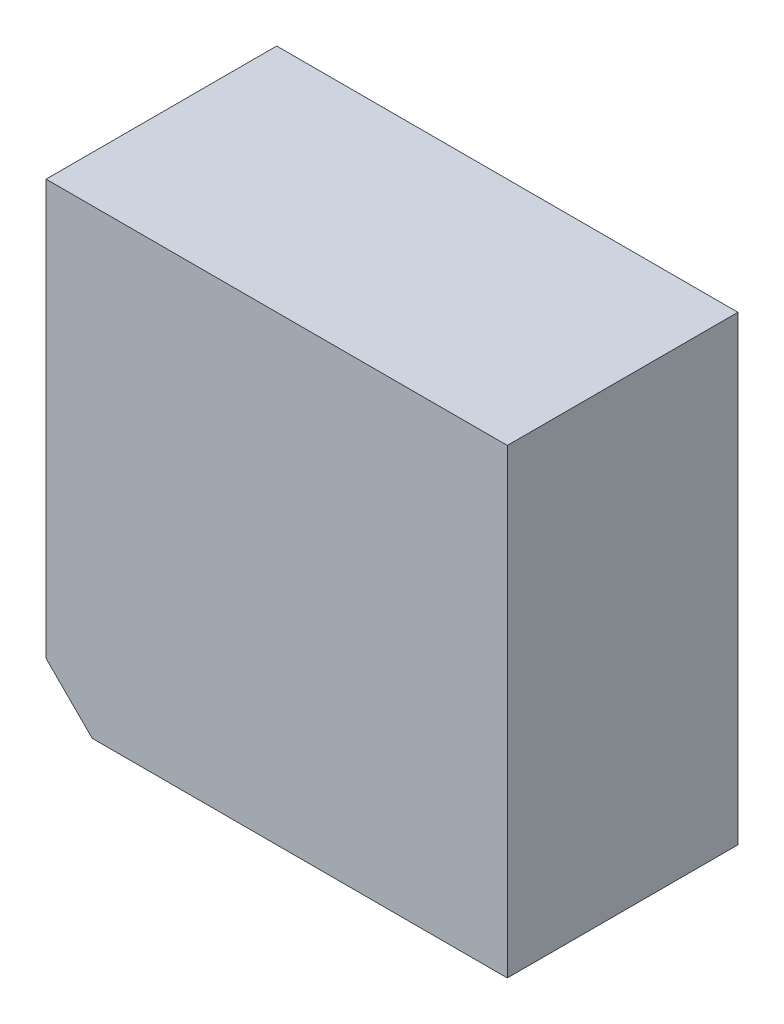
ISO-10303-21;
HEADER;
FILE_DESCRIPTION(('STEP AP214'),'2;1');
FILE_NAME('part.step','',(''),(''),'','','');
FILE_SCHEMA(('AUTOMOTIVE_DESIGN { 1 0 10303 214 1 1 1 1 }'));
ENDSEC;
DATA;
#1=APPLICATION_CONTEXT('core data for automotive mechanical design processes');
#2=APPLICATION_PROTOCOL_DEFINITION('international standard','automotive_design',2000,#1);
#3=PRODUCT_CONTEXT('',#1,'mechanical');
#4=PRODUCT('Part','Part','',(#3));
#5=PRODUCT_RELATED_PRODUCT_CATEGORY('part','',(#4));
#6=PRODUCT_DEFINITION_FORMATION('','',#4);
#7=PRODUCT_DEFINITION_CONTEXT('part definition',#1,'design');
#8=PRODUCT_DEFINITION('design','',#6,#7);
#9=PRODUCT_DEFINITION_SHAPE('','',#8);
#10=(LENGTH_UNIT() NAMED_UNIT(*) SI_UNIT(.MILLI.,.METRE.));
#11=(NAMED_UNIT(*) PLANE_ANGLE_UNIT() SI_UNIT($,.RADIAN.));
#12=(NAMED_UNIT(*) SI_UNIT($,.STERADIAN.) SOLID_ANGLE_UNIT());
#13=UNCERTAINTY_MEASURE_WITH_UNIT(LENGTH_MEASURE(1.E-05),#10,'distance_accuracy_value','');
#14=(GEOMETRIC_REPRESENTATION_CONTEXT(3) GLOBAL_UNCERTAINTY_ASSIGNED_CONTEXT((#13)) GLOBAL_UNIT_ASSIGNED_CONTEXT((#10,
#11,#12)) REPRESENTATION_CONTEXT('',''));
#15=CARTESIAN_POINT('',(0.,0.,0.));
#16=DIRECTION('',(0.,0.,1.));
#17=DIRECTION('',(1.,0.,0.));
#18=AXIS2_PLACEMENT_3D('',#15,#16,#17);
#19=CARTESIAN_POINT('',(0.,0.,10.));
#20=DIRECTION('',(1.,0.,0.));
#21=DIRECTION('',(0.,0.,-1.));
#22=AXIS2_PLACEMENT_3D('',#19,#20,#21);
#23=PLANE('',#22);
#24=DIRECTION('',(0.,-1.,0.));
#25=VECTOR('',#24,1.);
#26=CARTESIAN_POINT('',(0.,0.,0.));
#27=LINE('',#26,#25);
#28=CARTESIAN_POINT('',(0.,20.,0.));
#29=VERTEX_POINT('',#28);
#30=CARTESIAN_POINT('',(0.,2.00000000000001,0.));
#31=VERTEX_POINT('',#30);
#32=EDGE_CURVE('E125',#29,#31,#27,.T.);
#33=ORIENTED_EDGE('',*,*,#32,.T.);
#34=DIRECTION('',(0.,0.,1.));
#35=VECTOR('',#34,1.);
#36=CARTESIAN_POINT('',(0.,2.00000000000001,10.));
#37=LINE('',#36,#35);
#38=CARTESIAN_POINT('',(0.,2.00000000000001,10.));
#39=VERTEX_POINT('',#38);
#40=EDGE_CURVE('E53',#31,#39,#37,.T.);
#41=ORIENTED_EDGE('',*,*,#40,.T.);
#42=DIRECTION('',(0.,-1.,0.));
#43=VECTOR('',#42,1.);
#44=CARTESIAN_POINT('',(0.,0.,10.));
#45=LINE('',#44,#43);
#46=CARTESIAN_POINT('',(0.,20.,10.));
#47=VERTEX_POINT('',#46);
#48=EDGE_CURVE('E105',#47,#39,#45,.T.);
#49=ORIENTED_EDGE('',*,*,#48,.F.);
#50=DIRECTION('',(0.,0.,-1.));
#51=VECTOR('',#50,1.);
#52=CARTESIAN_POINT('',(0.,20.,10.));
#53=LINE('',#52,#51);
#54=EDGE_CURVE('E117',#47,#29,#53,.T.);
#55=ORIENTED_EDGE('',*,*,#54,.T.);
#56=EDGE_LOOP('',(#33,#41,#49,#55));
#57=FACE_BOUND('',#56,.T.);
#58=ADVANCED_FACE('F44',(#57),#23,.F.);
#59=CARTESIAN_POINT('',(0.,0.,10.));
#60=DIRECTION('',(0.,1.,0.));
#61=DIRECTION('',(0.,0.,1.));
#62=AXIS2_PLACEMENT_3D('',#59,#60,#61);
#63=PLANE('',#62);
#64=DIRECTION('',(1.,0.,0.));
#65=VECTOR('',#64,1.);
#66=CARTESIAN_POINT('',(0.,0.,10.));
#67=LINE('',#66,#65);
#68=CARTESIAN_POINT('',(2.,0.,10.));
#69=VERTEX_POINT('',#68);
#70=CARTESIAN_POINT('',(20.,0.,10.));
#71=VERTEX_POINT('',#70);
#72=EDGE_CURVE('E95',#69,#71,#67,.T.);
#73=ORIENTED_EDGE('',*,*,#72,.F.);
#74=DIRECTION('',(0.,0.,-1.));
#75=VECTOR('',#74,1.);
#76=CARTESIAN_POINT('',(2.,0.,10.));
#77=LINE('',#76,#75);
#78=CARTESIAN_POINT('',(2.,0.,0.));
#79=VERTEX_POINT('',#78);
#80=EDGE_CURVE('E109',#69,#79,#77,.T.);
#81=ORIENTED_EDGE('',*,*,#80,.T.);
#82=DIRECTION('',(1.,0.,0.));
#83=VECTOR('',#82,1.);
#84=CARTESIAN_POINT('',(0.,0.,0.));
#85=LINE('',#84,#83);
#86=CARTESIAN_POINT('',(20.,0.,0.));
#87=VERTEX_POINT('',#86);
#88=EDGE_CURVE('E110',#79,#87,#85,.T.);
#89=ORIENTED_EDGE('',*,*,#88,.T.);
#90=DIRECTION('',(0.,0.,-1.));
#91=VECTOR('',#90,1.);
#92=CARTESIAN_POINT('',(20.,0.,10.));
#93=LINE('',#92,#91);
#94=EDGE_CURVE('E104',#71,#87,#93,.T.);
#95=ORIENTED_EDGE('',*,*,#94,.F.);
#96=EDGE_LOOP('',(#73,#81,#89,#95));
#97=FACE_BOUND('',#96,.T.);
#98=ADVANCED_FACE('F106',(#97),#63,.F.);
#99=CARTESIAN_POINT('',(20.,0.,10.));
#100=DIRECTION('',(-1.,0.,0.));
#101=DIRECTION('',(0.,0.,1.));
#102=AXIS2_PLACEMENT_3D('',#99,#100,#101);
#103=PLANE('',#102);
#104=DIRECTION('',(0.,1.,0.));
#105=VECTOR('',#104,1.);
#106=CARTESIAN_POINT('',(20.,0.,0.));
#107=LINE('',#106,#105);
#108=CARTESIAN_POINT('',(20.,20.,0.));
#109=VERTEX_POINT('',#108);
#110=EDGE_CURVE('E124',#87,#109,#107,.T.);
#111=ORIENTED_EDGE('',*,*,#110,.T.);
#112=DIRECTION('',(0.,0.,-1.));
#113=VECTOR('',#112,1.);
#114=CARTESIAN_POINT('',(20.,20.,10.));
#115=LINE('',#114,#113);
#116=CARTESIAN_POINT('',(20.,20.,10.));
#117=VERTEX_POINT('',#116);
#118=EDGE_CURVE('E112',#117,#109,#115,.T.);
#119=ORIENTED_EDGE('',*,*,#118,.F.);
#120=DIRECTION('',(0.,1.,0.));
#121=VECTOR('',#120,1.);
#122=CARTESIAN_POINT('',(20.,0.,10.));
#123=LINE('',#122,#121);
#124=EDGE_CURVE('E96',#71,#117,#123,.T.);
#125=ORIENTED_EDGE('',*,*,#124,.F.);
#126=ORIENTED_EDGE('',*,*,#94,.T.);
#127=EDGE_LOOP('',(#111,#119,#125,#126));
#128=FACE_BOUND('',#127,.T.);
#129=ADVANCED_FACE('F114',(#128),#103,.F.);
#130=CARTESIAN_POINT('',(0.,20.,10.));
#131=DIRECTION('',(0.,-1.,0.));
#132=DIRECTION('',(0.,0.,-1.));
#133=AXIS2_PLACEMENT_3D('',#130,#131,#132);
#134=PLANE('',#133);
#135=DIRECTION('',(-1.,0.,0.));
#136=VECTOR('',#135,1.);
#137=CARTESIAN_POINT('',(0.,20.,0.));
#138=LINE('',#137,#136);
#139=EDGE_CURVE('E130',#109,#29,#138,.T.);
#140=ORIENTED_EDGE('',*,*,#139,.T.);
#141=ORIENTED_EDGE('',*,*,#54,.F.);
#142=DIRECTION('',(-1.,0.,0.));
#143=VECTOR('',#142,1.);
#144=CARTESIAN_POINT('',(0.,20.,10.));
#145=LINE('',#144,#143);
#146=EDGE_CURVE('E118',#117,#47,#145,.T.);
#147=ORIENTED_EDGE('',*,*,#146,.F.);
#148=ORIENTED_EDGE('',*,*,#118,.T.);
#149=EDGE_LOOP('',(#140,#141,#147,#148));
#150=FACE_BOUND('',#149,.T.);
#151=ADVANCED_FACE('F140',(#150),#134,.F.);
#152=CARTESIAN_POINT('',(0.,0.,10.));
#153=DIRECTION('',(0.,0.,-1.));
#154=DIRECTION('',(-1.,0.,0.));
#155=AXIS2_PLACEMENT_3D('',#152,#153,#154);
#156=PLANE('',#155);
#157=ORIENTED_EDGE('',*,*,#48,.T.);
#158=DIRECTION('',(-0.707106781186546,0.707106781186549,0.));
#159=VECTOR('',#158,1.);
#160=CARTESIAN_POINT('',(2.,0.,10.));
#161=LINE('',#160,#159);
#162=EDGE_CURVE('E11',#39,#69,#161,.F.);
#163=ORIENTED_EDGE('',*,*,#162,.T.);
#164=ORIENTED_EDGE('',*,*,#72,.T.);
#165=ORIENTED_EDGE('',*,*,#124,.T.);
#166=ORIENTED_EDGE('',*,*,#146,.T.);
#167=EDGE_LOOP('',(#157,#163,#164,#165,#166));
#168=FACE_BOUND('',#167,.T.);
#169=ADVANCED_FACE('F94',(#168),#156,.F.);
#170=CARTESIAN_POINT('',(0.,0.,0.));
#171=DIRECTION('',(0.,0.,-1.));
#172=DIRECTION('',(-1.,0.,0.));
#173=AXIS2_PLACEMENT_3D('',#170,#171,#172);
#174=PLANE('',#173);
#175=ORIENTED_EDGE('',*,*,#88,.F.);
#176=DIRECTION('',(0.707106781186546,-0.707106781186549,0.));
#177=VECTOR('',#176,1.);
#178=CARTESIAN_POINT('',(1.,0.999999999999999,0.));
#179=LINE('',#178,#177);
#180=EDGE_CURVE('E67',#79,#31,#179,.F.);
#181=ORIENTED_EDGE('',*,*,#180,.T.);
#182=ORIENTED_EDGE('',*,*,#32,.F.);
#183=ORIENTED_EDGE('',*,*,#139,.F.);
#184=ORIENTED_EDGE('',*,*,#110,.F.);
#185=EDGE_LOOP('',(#175,#181,#182,#183,#184));
#186=FACE_BOUND('',#185,.T.);
#187=ADVANCED_FACE('F135',(#186),#174,.T.);
#188=CARTESIAN_POINT('',(2.,0.,10.));
#189=DIRECTION('',(0.707106781186549,0.707106781186546,0.));
#190=DIRECTION('',(0.,0.,-1.));
#191=AXIS2_PLACEMENT_3D('',#188,#189,#190);
#192=PLANE('',#191);
#193=ORIENTED_EDGE('',*,*,#162,.F.);
#194=ORIENTED_EDGE('',*,*,#40,.F.);
#195=ORIENTED_EDGE('',*,*,#180,.F.);
#196=ORIENTED_EDGE('',*,*,#80,.F.);
#197=EDGE_LOOP('',(#193,#194,#195,#196));
#198=FACE_BOUND('',#197,.T.);
#199=ADVANCED_FACE('F48',(#198),#192,.F.);
#200=CLOSED_SHELL('',(#58,#98,#129,#151,#169,#187,#199));
#201=MANIFOLD_SOLID_BREP('B2',#200);
#202=ADVANCED_BREP_SHAPE_REPRESENTATION('',(#18,#201),#14);
#203=SHAPE_DEFINITION_REPRESENTATION(#9,#202);
ENDSEC;
END-ISO-10303-21;
